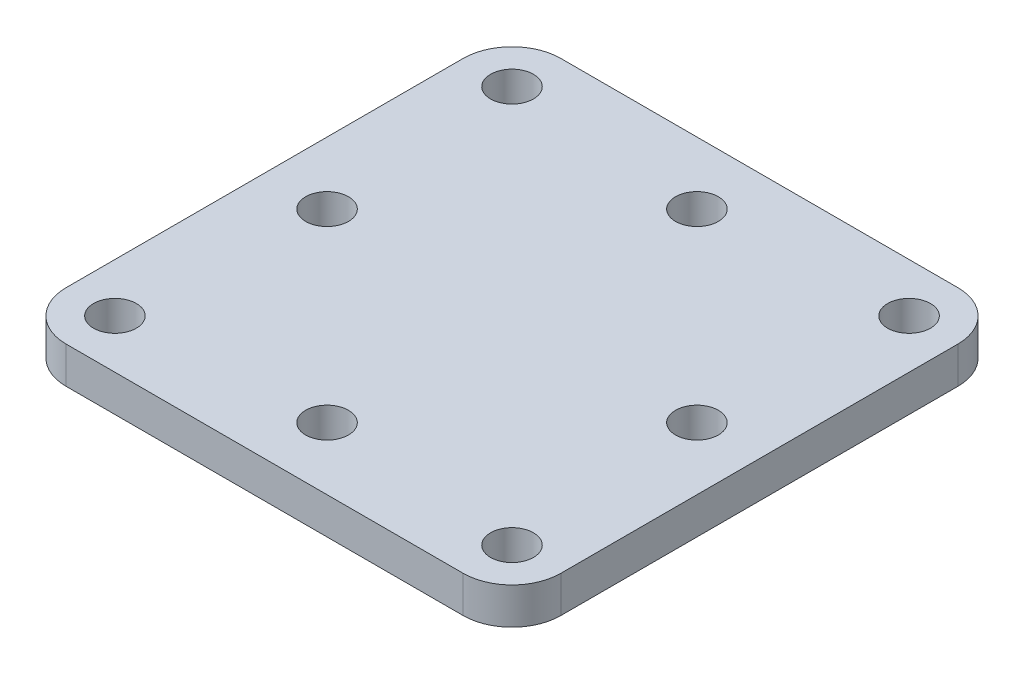
ISO-10303-21;
HEADER;
FILE_DESCRIPTION(('STEP AP214'),'2;1');
FILE_NAME('part.step','',(''),(''),'','','');
FILE_SCHEMA(('AUTOMOTIVE_DESIGN { 1 0 10303 214 1 1 1 1 }'));
ENDSEC;
DATA;
#1=APPLICATION_CONTEXT('core data for automotive mechanical design processes');
#2=APPLICATION_PROTOCOL_DEFINITION('international standard','automotive_design',2000,#1);
#3=PRODUCT_CONTEXT('',#1,'mechanical');
#4=PRODUCT('Part','Part','',(#3));
#5=PRODUCT_RELATED_PRODUCT_CATEGORY('part','',(#4));
#6=PRODUCT_DEFINITION_FORMATION('','',#4);
#7=PRODUCT_DEFINITION_CONTEXT('part definition',#1,'design');
#8=PRODUCT_DEFINITION('design','',#6,#7);
#9=PRODUCT_DEFINITION_SHAPE('','',#8);
#10=(LENGTH_UNIT() NAMED_UNIT(*) SI_UNIT(.MILLI.,.METRE.));
#11=(NAMED_UNIT(*) PLANE_ANGLE_UNIT() SI_UNIT($,.RADIAN.));
#12=(NAMED_UNIT(*) SI_UNIT($,.STERADIAN.) SOLID_ANGLE_UNIT());
#13=UNCERTAINTY_MEASURE_WITH_UNIT(LENGTH_MEASURE(1.E-05),#10,'distance_accuracy_value','');
#14=(GEOMETRIC_REPRESENTATION_CONTEXT(3) GLOBAL_UNCERTAINTY_ASSIGNED_CONTEXT((#13)) GLOBAL_UNIT_ASSIGNED_CONTEXT((#10,
#11,#12)) REPRESENTATION_CONTEXT('',''));
#15=CARTESIAN_POINT('',(0.,0.,0.));
#16=DIRECTION('',(0.,0.,1.));
#17=DIRECTION('',(1.,0.,0.));
#18=AXIS2_PLACEMENT_3D('',#15,#16,#17);
#19=CARTESIAN_POINT('',(0.,15.,0.));
#20=DIRECTION('',(0.,1.,0.));
#21=DIRECTION('',(0.,0.,1.));
#22=AXIS2_PLACEMENT_3D('',#19,#20,#21);
#23=PLANE('',#22);
#24=CARTESIAN_POINT('',(0.,15.,-15.15));
#25=DIRECTION('',(0.,1.,0.));
#26=DIRECTION('',(0.,0.,1.));
#27=AXIS2_PLACEMENT_3D('',#24,#25,#26);
#28=CIRCLE('',#27,1.755);
#29=CARTESIAN_POINT('',(0.,15.,-13.395));
#30=VERTEX_POINT('',#29);
#31=EDGE_CURVE('E44',#30,#30,#28,.T.);
#32=ORIENTED_EDGE('',*,*,#31,.F.);
#33=EDGE_LOOP('',(#32));
#34=FACE_BOUND('',#33,.T.);
#35=CARTESIAN_POINT('',(-15.15,15.,0.));
#36=DIRECTION('',(0.,1.,0.));
#37=DIRECTION('',(0.,0.,1.));
#38=AXIS2_PLACEMENT_3D('',#35,#36,#37);
#39=CIRCLE('',#38,1.755);
#40=CARTESIAN_POINT('',(-15.15,15.,1.755));
#41=VERTEX_POINT('',#40);
#42=EDGE_CURVE('E207',#41,#41,#39,.T.);
#43=ORIENTED_EDGE('',*,*,#42,.F.);
#44=EDGE_LOOP('',(#43));
#45=FACE_BOUND('',#44,.T.);
#46=CARTESIAN_POINT('',(0.,15.,15.15));
#47=DIRECTION('',(0.,1.,0.));
#48=DIRECTION('',(0.,0.,1.));
#49=AXIS2_PLACEMENT_3D('',#46,#47,#48);
#50=CIRCLE('',#49,1.755);
#51=CARTESIAN_POINT('',(0.,15.,16.905));
#52=VERTEX_POINT('',#51);
#53=EDGE_CURVE('E201',#52,#52,#50,.T.);
#54=ORIENTED_EDGE('',*,*,#53,.F.);
#55=EDGE_LOOP('',(#54));
#56=FACE_BOUND('',#55,.T.);
#57=CARTESIAN_POINT('',(15.15,15.,0.));
#58=DIRECTION('',(0.,1.,0.));
#59=DIRECTION('',(0.,0.,1.));
#60=AXIS2_PLACEMENT_3D('',#57,#58,#59);
#61=CIRCLE('',#60,1.755);
#62=CARTESIAN_POINT('',(15.15,15.,1.755));
#63=VERTEX_POINT('',#62);
#64=EDGE_CURVE('E195',#63,#63,#61,.T.);
#65=ORIENTED_EDGE('',*,*,#64,.F.);
#66=EDGE_LOOP('',(#65));
#67=FACE_BOUND('',#66,.T.);
#68=CARTESIAN_POINT('',(-16.2634559672906,15.,-16.2634559672906));
#69=DIRECTION('',(0.,1.,0.));
#70=DIRECTION('',(0.,0.,1.));
#71=AXIS2_PLACEMENT_3D('',#68,#69,#70);
#72=CIRCLE('',#71,1.755);
#73=CARTESIAN_POINT('',(-16.2634559672906,15.,-14.5084559672906));
#74=VERTEX_POINT('',#73);
#75=EDGE_CURVE('E189',#74,#74,#72,.T.);
#76=ORIENTED_EDGE('',*,*,#75,.F.);
#77=EDGE_LOOP('',(#76));
#78=FACE_BOUND('',#77,.T.);
#79=CARTESIAN_POINT('',(-16.2634559672906,15.,16.2634559672909));
#80=DIRECTION('',(0.,1.,0.));
#81=DIRECTION('',(0.,0.,1.));
#82=AXIS2_PLACEMENT_3D('',#79,#80,#81);
#83=CIRCLE('',#82,1.755);
#84=CARTESIAN_POINT('',(-16.2634559672906,15.,18.0184559672909));
#85=VERTEX_POINT('',#84);
#86=EDGE_CURVE('E186',#85,#85,#83,.T.);
#87=ORIENTED_EDGE('',*,*,#86,.F.);
#88=EDGE_LOOP('',(#87));
#89=FACE_BOUND('',#88,.T.);
#90=CARTESIAN_POINT('',(16.2634559672906,15.,-16.2634559672906));
#91=DIRECTION('',(0.,1.,0.));
#92=DIRECTION('',(0.,0.,1.));
#93=AXIS2_PLACEMENT_3D('',#90,#91,#92);
#94=CIRCLE('',#93,1.755);
#95=CARTESIAN_POINT('',(16.2634559672906,15.,-14.5084559672906));
#96=VERTEX_POINT('',#95);
#97=EDGE_CURVE('E180',#96,#96,#94,.T.);
#98=ORIENTED_EDGE('',*,*,#97,.F.);
#99=EDGE_LOOP('',(#98));
#100=FACE_BOUND('',#99,.T.);
#101=CARTESIAN_POINT('',(16.2634559672906,15.,16.2634559672906));
#102=DIRECTION('',(0.,1.,0.));
#103=DIRECTION('',(0.,0.,1.));
#104=AXIS2_PLACEMENT_3D('',#101,#102,#103);
#105=CIRCLE('',#104,1.755);
#106=CARTESIAN_POINT('',(16.2634559672906,15.,18.0184559672906));
#107=VERTEX_POINT('',#106);
#108=EDGE_CURVE('E174',#107,#107,#105,.T.);
#109=ORIENTED_EDGE('',*,*,#108,.F.);
#110=EDGE_LOOP('',(#109));
#111=FACE_BOUND('',#110,.T.);
#112=DIRECTION('',(-1.,0.,0.));
#113=VECTOR('',#112,1.);
#114=CARTESIAN_POINT('',(-16.2634559672906,15.,-20.2634559672906));
#115=LINE('',#114,#113);
#116=CARTESIAN_POINT('',(16.2634559672906,15.,-20.2634559672906));
#117=VERTEX_POINT('',#116);
#118=CARTESIAN_POINT('',(-16.2634559672906,15.,-20.2634559672906));
#119=VERTEX_POINT('',#118);
#120=EDGE_CURVE('E159',#117,#119,#115,.T.);
#121=ORIENTED_EDGE('',*,*,#120,.T.);
#122=CARTESIAN_POINT('',(-16.2634559672906,15.,-16.2634559672906));
#123=DIRECTION('',(0.,1.,0.));
#124=DIRECTION('',(0.,0.,-1.));
#125=AXIS2_PLACEMENT_3D('',#122,#123,#124);
#126=CIRCLE('',#125,4.);
#127=CARTESIAN_POINT('',(-20.2634559672906,15.,-16.2634559672906));
#128=VERTEX_POINT('',#127);
#129=EDGE_CURVE('E142',#119,#128,#126,.T.);
#130=ORIENTED_EDGE('',*,*,#129,.T.);
#131=DIRECTION('',(0.,0.,1.));
#132=VECTOR('',#131,1.);
#133=CARTESIAN_POINT('',(-20.2634559672906,15.,16.2634559672909));
#134=LINE('',#133,#132);
#135=CARTESIAN_POINT('',(-20.2634559672906,15.,16.2634559672909));
#136=VERTEX_POINT('',#135);
#137=EDGE_CURVE('E145',#128,#136,#134,.T.);
#138=ORIENTED_EDGE('',*,*,#137,.T.);
#139=CARTESIAN_POINT('',(-16.2634559672906,15.,16.2634559672909));
#140=DIRECTION('',(0.,1.,0.));
#141=DIRECTION('',(0.,0.,1.));
#142=AXIS2_PLACEMENT_3D('',#139,#140,#141);
#143=CIRCLE('',#142,4.);
#144=CARTESIAN_POINT('',(-16.2634559672906,15.,20.2634559672909));
#145=VERTEX_POINT('',#144);
#146=EDGE_CURVE('E55',#136,#145,#143,.T.);
#147=ORIENTED_EDGE('',*,*,#146,.T.);
#148=DIRECTION('',(1.,0.,0.));
#149=VECTOR('',#148,1.);
#150=CARTESIAN_POINT('',(16.2634559672906,15.,20.2634559672906));
#151=LINE('',#150,#149);
#152=CARTESIAN_POINT('',(16.2634559672906,15.,20.2634559672906));
#153=VERTEX_POINT('',#152);
#154=EDGE_CURVE('E112',#145,#153,#151,.T.);
#155=ORIENTED_EDGE('',*,*,#154,.T.);
#156=CARTESIAN_POINT('',(16.2634559672906,15.,16.2634559672906));
#157=DIRECTION('',(0.,1.,0.));
#158=DIRECTION('',(0.,0.,-1.));
#159=AXIS2_PLACEMENT_3D('',#156,#157,#158);
#160=CIRCLE('',#159,4.);
#161=CARTESIAN_POINT('',(20.2634559672906,15.,16.2634559672906));
#162=VERTEX_POINT('',#161);
#163=EDGE_CURVE('E150',#153,#162,#160,.T.);
#164=ORIENTED_EDGE('',*,*,#163,.T.);
#165=DIRECTION('',(0.,0.,-1.));
#166=VECTOR('',#165,1.);
#167=CARTESIAN_POINT('',(20.2634559672906,15.,-16.2634559672906));
#168=LINE('',#167,#166);
#169=CARTESIAN_POINT('',(20.2634559672906,15.,-16.2634559672906));
#170=VERTEX_POINT('',#169);
#171=EDGE_CURVE('E153',#162,#170,#168,.T.);
#172=ORIENTED_EDGE('',*,*,#171,.T.);
#173=CARTESIAN_POINT('',(16.2634559672906,15.,-16.2634559672906));
#174=DIRECTION('',(0.,1.,0.));
#175=DIRECTION('',(0.,0.,1.));
#176=AXIS2_PLACEMENT_3D('',#173,#174,#175);
#177=CIRCLE('',#176,4.);
#178=EDGE_CURVE('E156',#170,#117,#177,.T.);
#179=ORIENTED_EDGE('',*,*,#178,.T.);
#180=EDGE_LOOP('',(#121,#130,#138,#147,#155,#164,#172,#179));
#181=FACE_BOUND('',#180,.T.);
#182=ADVANCED_FACE('F41',(#34,#45,#56,#67,#78,#89,#100,#111,#181),#23,.T.);
#183=CARTESIAN_POINT('',(0.,12.,0.));
#184=DIRECTION('',(0.,1.,0.));
#185=DIRECTION('',(0.,0.,1.));
#186=AXIS2_PLACEMENT_3D('',#183,#184,#185);
#187=PLANE('',#186);
#188=CARTESIAN_POINT('',(0.,12.,-15.15));
#189=DIRECTION('',(0.,1.,0.));
#190=DIRECTION('',(0.,0.,1.));
#191=AXIS2_PLACEMENT_3D('',#188,#189,#190);
#192=CIRCLE('',#191,1.755);
#193=CARTESIAN_POINT('',(0.,12.,-13.395));
#194=VERTEX_POINT('',#193);
#195=EDGE_CURVE('E12',#194,#194,#192,.T.);
#196=ORIENTED_EDGE('',*,*,#195,.T.);
#197=EDGE_LOOP('',(#196));
#198=FACE_BOUND('',#197,.T.);
#199=CARTESIAN_POINT('',(-15.15,12.,0.));
#200=DIRECTION('',(0.,1.,0.));
#201=DIRECTION('',(0.,0.,1.));
#202=AXIS2_PLACEMENT_3D('',#199,#200,#201);
#203=CIRCLE('',#202,1.755);
#204=CARTESIAN_POINT('',(-15.15,12.,1.755));
#205=VERTEX_POINT('',#204);
#206=EDGE_CURVE('E210',#205,#205,#203,.T.);
#207=ORIENTED_EDGE('',*,*,#206,.T.);
#208=EDGE_LOOP('',(#207));
#209=FACE_BOUND('',#208,.T.);
#210=CARTESIAN_POINT('',(0.,12.,15.15));
#211=DIRECTION('',(0.,1.,0.));
#212=DIRECTION('',(0.,0.,1.));
#213=AXIS2_PLACEMENT_3D('',#210,#211,#212);
#214=CIRCLE('',#213,1.755);
#215=CARTESIAN_POINT('',(0.,12.,16.905));
#216=VERTEX_POINT('',#215);
#217=EDGE_CURVE('E204',#216,#216,#214,.T.);
#218=ORIENTED_EDGE('',*,*,#217,.T.);
#219=EDGE_LOOP('',(#218));
#220=FACE_BOUND('',#219,.T.);
#221=CARTESIAN_POINT('',(15.15,12.,0.));
#222=DIRECTION('',(0.,1.,0.));
#223=DIRECTION('',(0.,0.,1.));
#224=AXIS2_PLACEMENT_3D('',#221,#222,#223);
#225=CIRCLE('',#224,1.755);
#226=CARTESIAN_POINT('',(15.15,12.,1.755));
#227=VERTEX_POINT('',#226);
#228=EDGE_CURVE('E198',#227,#227,#225,.T.);
#229=ORIENTED_EDGE('',*,*,#228,.T.);
#230=EDGE_LOOP('',(#229));
#231=FACE_BOUND('',#230,.T.);
#232=CARTESIAN_POINT('',(-16.2634559672906,12.,-16.2634559672906));
#233=DIRECTION('',(0.,1.,0.));
#234=DIRECTION('',(0.,0.,1.));
#235=AXIS2_PLACEMENT_3D('',#232,#233,#234);
#236=CIRCLE('',#235,1.755);
#237=CARTESIAN_POINT('',(-16.2634559672906,12.,-14.5084559672906));
#238=VERTEX_POINT('',#237);
#239=EDGE_CURVE('E192',#238,#238,#236,.T.);
#240=ORIENTED_EDGE('',*,*,#239,.T.);
#241=EDGE_LOOP('',(#240));
#242=FACE_BOUND('',#241,.T.);
#243=CARTESIAN_POINT('',(-16.2634559672906,12.,16.2634559672909));
#244=DIRECTION('',(0.,1.,0.));
#245=DIRECTION('',(0.,0.,1.));
#246=AXIS2_PLACEMENT_3D('',#243,#244,#245);
#247=CIRCLE('',#246,1.755);
#248=CARTESIAN_POINT('',(-16.2634559672906,12.,18.0184559672909));
#249=VERTEX_POINT('',#248);
#250=EDGE_CURVE('E183',#249,#249,#247,.T.);
#251=ORIENTED_EDGE('',*,*,#250,.T.);
#252=EDGE_LOOP('',(#251));
#253=FACE_BOUND('',#252,.T.);
#254=CARTESIAN_POINT('',(16.2634559672906,12.,-16.2634559672906));
#255=DIRECTION('',(0.,1.,0.));
#256=DIRECTION('',(0.,0.,1.));
#257=AXIS2_PLACEMENT_3D('',#254,#255,#256);
#258=CIRCLE('',#257,1.755);
#259=CARTESIAN_POINT('',(16.2634559672906,12.,-14.5084559672906));
#260=VERTEX_POINT('',#259);
#261=EDGE_CURVE('E177',#260,#260,#258,.T.);
#262=ORIENTED_EDGE('',*,*,#261,.T.);
#263=EDGE_LOOP('',(#262));
#264=FACE_BOUND('',#263,.T.);
#265=CARTESIAN_POINT('',(16.2634559672906,12.,16.2634559672906));
#266=DIRECTION('',(0.,1.,0.));
#267=DIRECTION('',(0.,0.,1.));
#268=AXIS2_PLACEMENT_3D('',#265,#266,#267);
#269=CIRCLE('',#268,1.755);
#270=CARTESIAN_POINT('',(16.2634559672906,12.,18.0184559672906));
#271=VERTEX_POINT('',#270);
#272=EDGE_CURVE('E164',#271,#271,#269,.T.);
#273=ORIENTED_EDGE('',*,*,#272,.T.);
#274=EDGE_LOOP('',(#273));
#275=FACE_BOUND('',#274,.T.);
#276=CARTESIAN_POINT('',(-16.2634559672906,12.,-16.2634559672906));
#277=DIRECTION('',(0.,1.,0.));
#278=DIRECTION('',(0.,0.,-1.));
#279=AXIS2_PLACEMENT_3D('',#276,#277,#278);
#280=CIRCLE('',#279,4.);
#281=CARTESIAN_POINT('',(-16.2634559672906,12.,-20.2634559672906));
#282=VERTEX_POINT('',#281);
#283=CARTESIAN_POINT('',(-20.2634559672906,12.,-16.2634559672906));
#284=VERTEX_POINT('',#283);
#285=EDGE_CURVE('E63',#282,#284,#280,.T.);
#286=ORIENTED_EDGE('',*,*,#285,.F.);
#287=DIRECTION('',(-1.,0.,0.));
#288=VECTOR('',#287,1.);
#289=CARTESIAN_POINT('',(-16.2634559672906,12.,-20.2634559672906));
#290=LINE('',#289,#288);
#291=CARTESIAN_POINT('',(16.2634559672906,12.,-20.2634559672906));
#292=VERTEX_POINT('',#291);
#293=EDGE_CURVE('E138',#292,#282,#290,.T.);
#294=ORIENTED_EDGE('',*,*,#293,.F.);
#295=CARTESIAN_POINT('',(16.2634559672906,12.,-16.2634559672906));
#296=DIRECTION('',(0.,1.,0.));
#297=DIRECTION('',(0.,0.,1.));
#298=AXIS2_PLACEMENT_3D('',#295,#296,#297);
#299=CIRCLE('',#298,4.);
#300=CARTESIAN_POINT('',(20.2634559672906,12.,-16.2634559672906));
#301=VERTEX_POINT('',#300);
#302=EDGE_CURVE('E135',#301,#292,#299,.T.);
#303=ORIENTED_EDGE('',*,*,#302,.F.);
#304=DIRECTION('',(0.,0.,-1.));
#305=VECTOR('',#304,1.);
#306=CARTESIAN_POINT('',(20.2634559672906,12.,-16.2634559672906));
#307=LINE('',#306,#305);
#308=CARTESIAN_POINT('',(20.2634559672906,12.,16.2634559672906));
#309=VERTEX_POINT('',#308);
#310=EDGE_CURVE('E129',#309,#301,#307,.T.);
#311=ORIENTED_EDGE('',*,*,#310,.F.);
#312=CARTESIAN_POINT('',(16.2634559672906,12.,16.2634559672906));
#313=DIRECTION('',(0.,1.,0.));
#314=DIRECTION('',(0.,0.,-1.));
#315=AXIS2_PLACEMENT_3D('',#312,#313,#314);
#316=CIRCLE('',#315,4.);
#317=CARTESIAN_POINT('',(16.2634559672906,12.,20.2634559672906));
#318=VERTEX_POINT('',#317);
#319=EDGE_CURVE('E127',#318,#309,#316,.T.);
#320=ORIENTED_EDGE('',*,*,#319,.F.);
#321=DIRECTION('',(1.,0.,0.));
#322=VECTOR('',#321,1.);
#323=CARTESIAN_POINT('',(16.2634559672906,12.,20.2634559672906));
#324=LINE('',#323,#322);
#325=CARTESIAN_POINT('',(-16.2634559672906,12.,20.2634559672909));
#326=VERTEX_POINT('',#325);
#327=EDGE_CURVE('E109',#326,#318,#324,.T.);
#328=ORIENTED_EDGE('',*,*,#327,.F.);
#329=CARTESIAN_POINT('',(-16.2634559672906,12.,16.2634559672909));
#330=DIRECTION('',(0.,1.,0.));
#331=DIRECTION('',(0.,0.,1.));
#332=AXIS2_PLACEMENT_3D('',#329,#330,#331);
#333=CIRCLE('',#332,4.);
#334=CARTESIAN_POINT('',(-20.2634559672906,12.,16.2634559672909));
#335=VERTEX_POINT('',#334);
#336=EDGE_CURVE('E117',#335,#326,#333,.T.);
#337=ORIENTED_EDGE('',*,*,#336,.F.);
#338=DIRECTION('',(0.,0.,1.));
#339=VECTOR('',#338,1.);
#340=CARTESIAN_POINT('',(-20.2634559672906,12.,16.2634559672909));
#341=LINE('',#340,#339);
#342=EDGE_CURVE('E122',#284,#335,#341,.T.);
#343=ORIENTED_EDGE('',*,*,#342,.F.);
#344=EDGE_LOOP('',(#286,#294,#303,#311,#320,#328,#337,#343));
#345=FACE_BOUND('',#344,.T.);
#346=ADVANCED_FACE('F124',(#198,#209,#220,#231,#242,#253,#264,#275,#345),#187,.F.);
#347=CARTESIAN_POINT('',(0.,12.,-15.15));
#348=DIRECTION('',(0.,1.,0.));
#349=DIRECTION('',(0.,0.,1.));
#350=AXIS2_PLACEMENT_3D('',#347,#348,#349);
#351=CYLINDRICAL_SURFACE('',#350,1.755);
#352=ORIENTED_EDGE('',*,*,#195,.F.);
#353=EDGE_LOOP('',(#352));
#354=FACE_BOUND('',#353,.T.);
#355=ORIENTED_EDGE('',*,*,#31,.T.);
#356=EDGE_LOOP('',(#355));
#357=FACE_BOUND('',#356,.T.);
#358=ADVANCED_FACE('F298',(#354,#357),#351,.F.);
#359=CARTESIAN_POINT('',(-15.15,12.,0.));
#360=DIRECTION('',(0.,1.,0.));
#361=DIRECTION('',(0.,0.,1.));
#362=AXIS2_PLACEMENT_3D('',#359,#360,#361);
#363=CYLINDRICAL_SURFACE('',#362,1.755);
#364=ORIENTED_EDGE('',*,*,#206,.F.);
#365=EDGE_LOOP('',(#364));
#366=FACE_BOUND('',#365,.T.);
#367=ORIENTED_EDGE('',*,*,#42,.T.);
#368=EDGE_LOOP('',(#367));
#369=FACE_BOUND('',#368,.T.);
#370=ADVANCED_FACE('F216',(#366,#369),#363,.F.);
#371=CARTESIAN_POINT('',(0.,12.,15.15));
#372=DIRECTION('',(0.,1.,0.));
#373=DIRECTION('',(0.,0.,1.));
#374=AXIS2_PLACEMENT_3D('',#371,#372,#373);
#375=CYLINDRICAL_SURFACE('',#374,1.755);
#376=ORIENTED_EDGE('',*,*,#217,.F.);
#377=EDGE_LOOP('',(#376));
#378=FACE_BOUND('',#377,.T.);
#379=ORIENTED_EDGE('',*,*,#53,.T.);
#380=EDGE_LOOP('',(#379));
#381=FACE_BOUND('',#380,.T.);
#382=ADVANCED_FACE('F291',(#378,#381),#375,.F.);
#383=CARTESIAN_POINT('',(15.15,12.,0.));
#384=DIRECTION('',(0.,1.,0.));
#385=DIRECTION('',(0.,0.,1.));
#386=AXIS2_PLACEMENT_3D('',#383,#384,#385);
#387=CYLINDRICAL_SURFACE('',#386,1.755);
#388=ORIENTED_EDGE('',*,*,#228,.F.);
#389=EDGE_LOOP('',(#388));
#390=FACE_BOUND('',#389,.T.);
#391=ORIENTED_EDGE('',*,*,#64,.T.);
#392=EDGE_LOOP('',(#391));
#393=FACE_BOUND('',#392,.T.);
#394=ADVANCED_FACE('F287',(#390,#393),#387,.F.);
#395=CARTESIAN_POINT('',(-16.2634559672906,12.,-16.2634559672906));
#396=DIRECTION('',(0.,1.,0.));
#397=DIRECTION('',(0.,0.,1.));
#398=AXIS2_PLACEMENT_3D('',#395,#396,#397);
#399=CYLINDRICAL_SURFACE('',#398,1.755);
#400=ORIENTED_EDGE('',*,*,#239,.F.);
#401=EDGE_LOOP('',(#400));
#402=FACE_BOUND('',#401,.T.);
#403=ORIENTED_EDGE('',*,*,#75,.T.);
#404=EDGE_LOOP('',(#403));
#405=FACE_BOUND('',#404,.T.);
#406=ADVANCED_FACE('F283',(#402,#405),#399,.F.);
#407=CARTESIAN_POINT('',(-16.2634559672906,12.,16.2634559672909));
#408=DIRECTION('',(0.,1.,0.));
#409=DIRECTION('',(0.,0.,1.));
#410=AXIS2_PLACEMENT_3D('',#407,#408,#409);
#411=CYLINDRICAL_SURFACE('',#410,1.755);
#412=ORIENTED_EDGE('',*,*,#250,.F.);
#413=EDGE_LOOP('',(#412));
#414=FACE_BOUND('',#413,.T.);
#415=ORIENTED_EDGE('',*,*,#86,.T.);
#416=EDGE_LOOP('',(#415));
#417=FACE_BOUND('',#416,.T.);
#418=ADVANCED_FACE('F279',(#414,#417),#411,.F.);
#419=CARTESIAN_POINT('',(16.2634559672906,12.,-16.2634559672906));
#420=DIRECTION('',(0.,1.,0.));
#421=DIRECTION('',(0.,0.,1.));
#422=AXIS2_PLACEMENT_3D('',#419,#420,#421);
#423=CYLINDRICAL_SURFACE('',#422,1.755);
#424=ORIENTED_EDGE('',*,*,#261,.F.);
#425=EDGE_LOOP('',(#424));
#426=FACE_BOUND('',#425,.T.);
#427=ORIENTED_EDGE('',*,*,#97,.T.);
#428=EDGE_LOOP('',(#427));
#429=FACE_BOUND('',#428,.T.);
#430=ADVANCED_FACE('F275',(#426,#429),#423,.F.);
#431=CARTESIAN_POINT('',(16.2634559672906,12.,16.2634559672906));
#432=DIRECTION('',(0.,1.,0.));
#433=DIRECTION('',(0.,0.,1.));
#434=AXIS2_PLACEMENT_3D('',#431,#432,#433);
#435=CYLINDRICAL_SURFACE('',#434,1.755);
#436=ORIENTED_EDGE('',*,*,#272,.F.);
#437=EDGE_LOOP('',(#436));
#438=FACE_BOUND('',#437,.T.);
#439=ORIENTED_EDGE('',*,*,#108,.T.);
#440=EDGE_LOOP('',(#439));
#441=FACE_BOUND('',#440,.T.);
#442=ADVANCED_FACE('F272',(#438,#441),#435,.F.);
#443=CARTESIAN_POINT('',(-16.2634559672906,12.,-16.2634559672906));
#444=DIRECTION('',(0.,1.,0.));
#445=DIRECTION('',(0.,0.,1.));
#446=AXIS2_PLACEMENT_3D('',#443,#444,#445);
#447=CYLINDRICAL_SURFACE('',#446,4.);
#448=ORIENTED_EDGE('',*,*,#129,.F.);
#449=DIRECTION('',(0.,1.,0.));
#450=VECTOR('',#449,1.);
#451=CARTESIAN_POINT('',(-16.2634559672906,12.,-20.2634559672906));
#452=LINE('',#451,#450);
#453=EDGE_CURVE('E162',#282,#119,#452,.T.);
#454=ORIENTED_EDGE('',*,*,#453,.F.);
#455=ORIENTED_EDGE('',*,*,#285,.T.);
#456=DIRECTION('',(0.,1.,0.));
#457=VECTOR('',#456,1.);
#458=CARTESIAN_POINT('',(-20.2634559672906,12.,-16.2634559672906));
#459=LINE('',#458,#457);
#460=EDGE_CURVE('E141',#284,#128,#459,.T.);
#461=ORIENTED_EDGE('',*,*,#460,.T.);
#462=EDGE_LOOP('',(#448,#454,#455,#461));
#463=FACE_BOUND('',#462,.T.);
#464=ADVANCED_FACE('F239',(#463),#447,.T.);
#465=CARTESIAN_POINT('',(-16.2634559672906,12.,-20.2634559672906));
#466=DIRECTION('',(0.,0.,-1.));
#467=DIRECTION('',(-1.,0.,0.));
#468=AXIS2_PLACEMENT_3D('',#465,#466,#467);
#469=PLANE('',#468);
#470=ORIENTED_EDGE('',*,*,#120,.F.);
#471=DIRECTION('',(0.,1.,0.));
#472=VECTOR('',#471,1.);
#473=CARTESIAN_POINT('',(16.2634559672906,12.,-20.2634559672906));
#474=LINE('',#473,#472);
#475=EDGE_CURVE('E165',#292,#117,#474,.T.);
#476=ORIENTED_EDGE('',*,*,#475,.F.);
#477=ORIENTED_EDGE('',*,*,#293,.T.);
#478=ORIENTED_EDGE('',*,*,#453,.T.);
#479=EDGE_LOOP('',(#470,#476,#477,#478));
#480=FACE_BOUND('',#479,.T.);
#481=ADVANCED_FACE('F237',(#480),#469,.T.);
#482=CARTESIAN_POINT('',(16.2634559672906,12.,-16.2634559672906));
#483=DIRECTION('',(0.,1.,0.));
#484=DIRECTION('',(0.,0.,1.));
#485=AXIS2_PLACEMENT_3D('',#482,#483,#484);
#486=CYLINDRICAL_SURFACE('',#485,4.);
#487=ORIENTED_EDGE('',*,*,#178,.F.);
#488=DIRECTION('',(0.,1.,0.));
#489=VECTOR('',#488,1.);
#490=CARTESIAN_POINT('',(20.2634559672906,12.,-16.2634559672906));
#491=LINE('',#490,#489);
#492=EDGE_CURVE('E167',#301,#170,#491,.T.);
#493=ORIENTED_EDGE('',*,*,#492,.F.);
#494=ORIENTED_EDGE('',*,*,#302,.T.);
#495=ORIENTED_EDGE('',*,*,#475,.T.);
#496=EDGE_LOOP('',(#487,#493,#494,#495));
#497=FACE_BOUND('',#496,.T.);
#498=ADVANCED_FACE('F251',(#497),#486,.T.);
#499=CARTESIAN_POINT('',(20.2634559672906,12.,-16.2634559672906));
#500=DIRECTION('',(1.,0.,0.));
#501=DIRECTION('',(0.,0.,-1.));
#502=AXIS2_PLACEMENT_3D('',#499,#500,#501);
#503=PLANE('',#502);
#504=ORIENTED_EDGE('',*,*,#171,.F.);
#505=DIRECTION('',(0.,1.,0.));
#506=VECTOR('',#505,1.);
#507=CARTESIAN_POINT('',(20.2634559672906,12.,16.2634559672906));
#508=LINE('',#507,#506);
#509=EDGE_CURVE('E169',#309,#162,#508,.T.);
#510=ORIENTED_EDGE('',*,*,#509,.F.);
#511=ORIENTED_EDGE('',*,*,#310,.T.);
#512=ORIENTED_EDGE('',*,*,#492,.T.);
#513=EDGE_LOOP('',(#504,#510,#511,#512));
#514=FACE_BOUND('',#513,.T.);
#515=ADVANCED_FACE('F248',(#514),#503,.T.);
#516=CARTESIAN_POINT('',(16.2634559672906,12.,16.2634559672906));
#517=DIRECTION('',(0.,1.,0.));
#518=DIRECTION('',(0.,0.,1.));
#519=AXIS2_PLACEMENT_3D('',#516,#517,#518);
#520=CYLINDRICAL_SURFACE('',#519,4.);
#521=ORIENTED_EDGE('',*,*,#163,.F.);
#522=DIRECTION('',(0.,1.,0.));
#523=VECTOR('',#522,1.);
#524=CARTESIAN_POINT('',(16.2634559672906,12.,20.2634559672906));
#525=LINE('',#524,#523);
#526=EDGE_CURVE('E113',#318,#153,#525,.T.);
#527=ORIENTED_EDGE('',*,*,#526,.F.);
#528=ORIENTED_EDGE('',*,*,#319,.T.);
#529=ORIENTED_EDGE('',*,*,#509,.T.);
#530=EDGE_LOOP('',(#521,#527,#528,#529));
#531=FACE_BOUND('',#530,.T.);
#532=ADVANCED_FACE('F246',(#531),#520,.T.);
#533=CARTESIAN_POINT('',(16.2634559672906,12.,20.2634559672906));
#534=DIRECTION('',(0.,0.,1.));
#535=DIRECTION('',(1.,0.,0.));
#536=AXIS2_PLACEMENT_3D('',#533,#534,#535);
#537=PLANE('',#536);
#538=ORIENTED_EDGE('',*,*,#154,.F.);
#539=DIRECTION('',(0.,1.,0.));
#540=VECTOR('',#539,1.);
#541=CARTESIAN_POINT('',(-16.2634559672906,12.,20.2634559672909));
#542=LINE('',#541,#540);
#543=EDGE_CURVE('E105',#326,#145,#542,.T.);
#544=ORIENTED_EDGE('',*,*,#543,.F.);
#545=ORIENTED_EDGE('',*,*,#327,.T.);
#546=ORIENTED_EDGE('',*,*,#526,.T.);
#547=EDGE_LOOP('',(#538,#544,#545,#546));
#548=FACE_BOUND('',#547,.T.);
#549=ADVANCED_FACE('F107',(#548),#537,.T.);
#550=CARTESIAN_POINT('',(-16.2634559672906,12.,16.2634559672909));
#551=DIRECTION('',(0.,1.,0.));
#552=DIRECTION('',(0.,0.,1.));
#553=AXIS2_PLACEMENT_3D('',#550,#551,#552);
#554=CYLINDRICAL_SURFACE('',#553,4.);
#555=ORIENTED_EDGE('',*,*,#146,.F.);
#556=DIRECTION('',(0.,1.,0.));
#557=VECTOR('',#556,1.);
#558=CARTESIAN_POINT('',(-20.2634559672906,12.,16.2634559672909));
#559=LINE('',#558,#557);
#560=EDGE_CURVE('E114',#335,#136,#559,.T.);
#561=ORIENTED_EDGE('',*,*,#560,.F.);
#562=ORIENTED_EDGE('',*,*,#336,.T.);
#563=ORIENTED_EDGE('',*,*,#543,.T.);
#564=EDGE_LOOP('',(#555,#561,#562,#563));
#565=FACE_BOUND('',#564,.T.);
#566=ADVANCED_FACE('F118',(#565),#554,.T.);
#567=CARTESIAN_POINT('',(-20.2634559672906,12.,16.2634559672909));
#568=DIRECTION('',(-1.,0.,0.));
#569=DIRECTION('',(0.,0.,1.));
#570=AXIS2_PLACEMENT_3D('',#567,#568,#569);
#571=PLANE('',#570);
#572=ORIENTED_EDGE('',*,*,#137,.F.);
#573=ORIENTED_EDGE('',*,*,#460,.F.);
#574=ORIENTED_EDGE('',*,*,#342,.T.);
#575=ORIENTED_EDGE('',*,*,#560,.T.);
#576=EDGE_LOOP('',(#572,#573,#574,#575));
#577=FACE_BOUND('',#576,.T.);
#578=ADVANCED_FACE('F242',(#577),#571,.T.);
#579=CLOSED_SHELL('',(#182,#346,#358,#370,#382,#394,#406,#418,#430,#442,#464,#481,#498,#515,
#532,#549,#566,#578));
#580=MANIFOLD_SOLID_BREP('B2',#579);
#581=ADVANCED_BREP_SHAPE_REPRESENTATION('',(#18,#580),#14);
#582=SHAPE_DEFINITION_REPRESENTATION(#9,#581);
ENDSEC;
END-ISO-10303-21;
